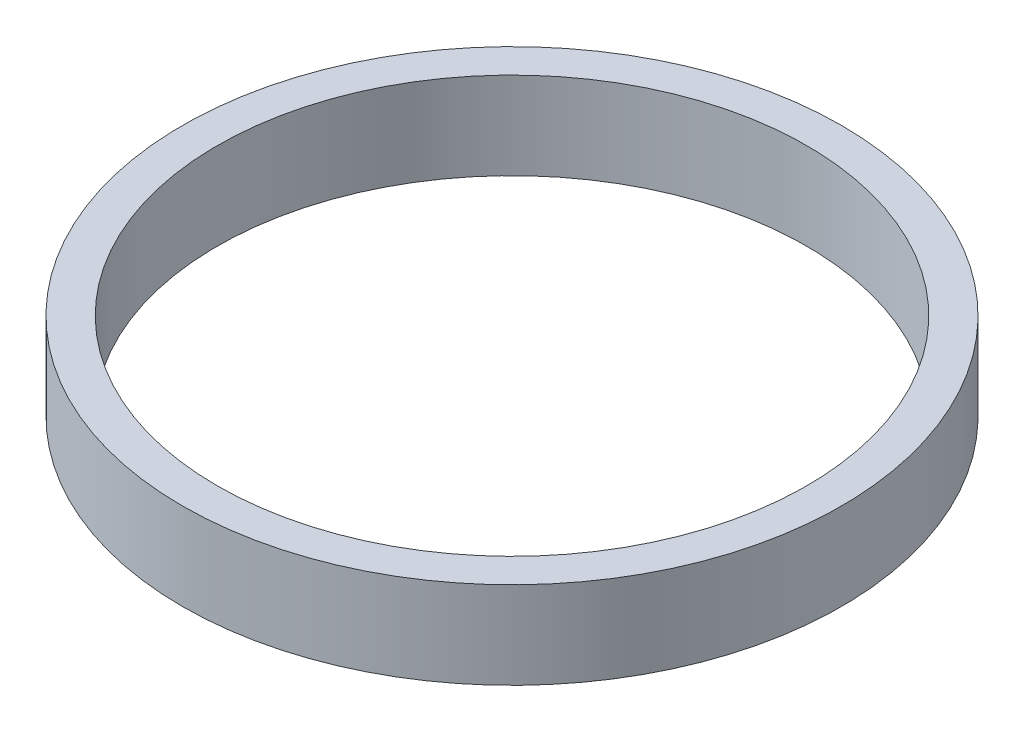
ISO-10303-21;
HEADER;
FILE_DESCRIPTION(('STEP AP214'),'2;1');
FILE_NAME('part.step','',(''),(''),'','','');
FILE_SCHEMA(('AUTOMOTIVE_DESIGN { 1 0 10303 214 1 1 1 1 }'));
ENDSEC;
DATA;
#1=APPLICATION_CONTEXT('core data for automotive mechanical design processes');
#2=APPLICATION_PROTOCOL_DEFINITION('international standard','automotive_design',2000,#1);
#3=PRODUCT_CONTEXT('',#1,'mechanical');
#4=PRODUCT('Part','Part','',(#3));
#5=PRODUCT_RELATED_PRODUCT_CATEGORY('part','',(#4));
#6=PRODUCT_DEFINITION_FORMATION('','',#4);
#7=PRODUCT_DEFINITION_CONTEXT('part definition',#1,'design');
#8=PRODUCT_DEFINITION('design','',#6,#7);
#9=PRODUCT_DEFINITION_SHAPE('','',#8);
#10=(LENGTH_UNIT() NAMED_UNIT(*) SI_UNIT(.MILLI.,.METRE.));
#11=(NAMED_UNIT(*) PLANE_ANGLE_UNIT() SI_UNIT($,.RADIAN.));
#12=(NAMED_UNIT(*) SI_UNIT($,.STERADIAN.) SOLID_ANGLE_UNIT());
#13=UNCERTAINTY_MEASURE_WITH_UNIT(LENGTH_MEASURE(1.E-05),#10,'distance_accuracy_value','');
#14=(GEOMETRIC_REPRESENTATION_CONTEXT(3) GLOBAL_UNCERTAINTY_ASSIGNED_CONTEXT((#13)) GLOBAL_UNIT_ASSIGNED_CONTEXT((#10,
#11,#12)) REPRESENTATION_CONTEXT('',''));
#15=CARTESIAN_POINT('',(0.,0.,0.));
#16=DIRECTION('',(0.,0.,1.));
#17=DIRECTION('',(1.,0.,0.));
#18=AXIS2_PLACEMENT_3D('',#15,#16,#17);
#19=CARTESIAN_POINT('',(0.,3.,0.));
#20=DIRECTION('',(0.,1.,0.));
#21=DIRECTION('',(0.,0.,1.));
#22=AXIS2_PLACEMENT_3D('',#19,#20,#21);
#23=PLANE('',#22);
#24=CARTESIAN_POINT('',(0.,3.,0.));
#25=DIRECTION('',(0.,1.,0.));
#26=DIRECTION('',(0.,0.,1.));
#27=AXIS2_PLACEMENT_3D('',#24,#25,#26);
#28=CIRCLE('',#27,11.35);
#29=CARTESIAN_POINT('',(0.,3.,11.35));
#30=VERTEX_POINT('',#29);
#31=EDGE_CURVE('E10',#30,#30,#28,.T.);
#32=ORIENTED_EDGE('',*,*,#31,.T.);
#33=EDGE_LOOP('',(#32));
#34=FACE_BOUND('',#33,.T.);
#35=CARTESIAN_POINT('',(0.,3.,0.));
#36=DIRECTION('',(0.,1.,0.));
#37=DIRECTION('',(0.,0.,1.));
#38=AXIS2_PLACEMENT_3D('',#35,#36,#37);
#39=CIRCLE('',#38,10.15);
#40=CARTESIAN_POINT('',(0.,3.,10.15));
#41=VERTEX_POINT('',#40);
#42=EDGE_CURVE('E44',#41,#41,#39,.T.);
#43=ORIENTED_EDGE('',*,*,#42,.F.);
#44=EDGE_LOOP('',(#43));
#45=FACE_BOUND('',#44,.T.);
#46=ADVANCED_FACE('F33',(#34,#45),#23,.T.);
#47=CARTESIAN_POINT('',(0.,0.,0.));
#48=DIRECTION('',(0.,1.,0.));
#49=DIRECTION('',(0.,0.,1.));
#50=AXIS2_PLACEMENT_3D('',#47,#48,#49);
#51=PLANE('',#50);
#52=CARTESIAN_POINT('',(0.,0.,0.));
#53=DIRECTION('',(0.,1.,0.));
#54=DIRECTION('',(0.,0.,1.));
#55=AXIS2_PLACEMENT_3D('',#52,#53,#54);
#56=CIRCLE('',#55,11.35);
#57=CARTESIAN_POINT('',(0.,0.,11.35));
#58=VERTEX_POINT('',#57);
#59=EDGE_CURVE('E37',#58,#58,#56,.T.);
#60=ORIENTED_EDGE('',*,*,#59,.F.);
#61=EDGE_LOOP('',(#60));
#62=FACE_BOUND('',#61,.T.);
#63=CARTESIAN_POINT('',(0.,0.,0.));
#64=DIRECTION('',(0.,1.,0.));
#65=DIRECTION('',(0.,0.,1.));
#66=AXIS2_PLACEMENT_3D('',#63,#64,#65);
#67=CIRCLE('',#66,10.15);
#68=CARTESIAN_POINT('',(0.,0.,10.15));
#69=VERTEX_POINT('',#68);
#70=EDGE_CURVE('E46',#69,#69,#67,.T.);
#71=ORIENTED_EDGE('',*,*,#70,.T.);
#72=EDGE_LOOP('',(#71));
#73=FACE_BOUND('',#72,.T.);
#74=ADVANCED_FACE('F56',(#62,#73),#51,.F.);
#75=CARTESIAN_POINT('',(0.,3.,0.));
#76=DIRECTION('',(0.,-1.,0.));
#77=DIRECTION('',(0.,0.,-1.));
#78=AXIS2_PLACEMENT_3D('',#75,#76,#77);
#79=CYLINDRICAL_SURFACE('',#78,11.35);
#80=ORIENTED_EDGE('',*,*,#31,.F.);
#81=EDGE_LOOP('',(#80));
#82=FACE_BOUND('',#81,.T.);
#83=ORIENTED_EDGE('',*,*,#59,.T.);
#84=EDGE_LOOP('',(#83));
#85=FACE_BOUND('',#84,.T.);
#86=ADVANCED_FACE('F35',(#82,#85),#79,.T.);
#87=CARTESIAN_POINT('',(0.,3.,0.));
#88=DIRECTION('',(0.,-1.,0.));
#89=DIRECTION('',(0.,0.,-1.));
#90=AXIS2_PLACEMENT_3D('',#87,#88,#89);
#91=CYLINDRICAL_SURFACE('',#90,10.15);
#92=ORIENTED_EDGE('',*,*,#42,.T.);
#93=EDGE_LOOP('',(#92));
#94=FACE_BOUND('',#93,.T.);
#95=ORIENTED_EDGE('',*,*,#70,.F.);
#96=EDGE_LOOP('',(#95));
#97=FACE_BOUND('',#96,.T.);
#98=ADVANCED_FACE('F52',(#94,#97),#91,.F.);
#99=CLOSED_SHELL('',(#46,#74,#86,#98));
#100=MANIFOLD_SOLID_BREP('B2',#99);
#101=ADVANCED_BREP_SHAPE_REPRESENTATION('',(#18,#100),#14);
#102=SHAPE_DEFINITION_REPRESENTATION(#9,#101);
ENDSEC;
END-ISO-10303-21;
